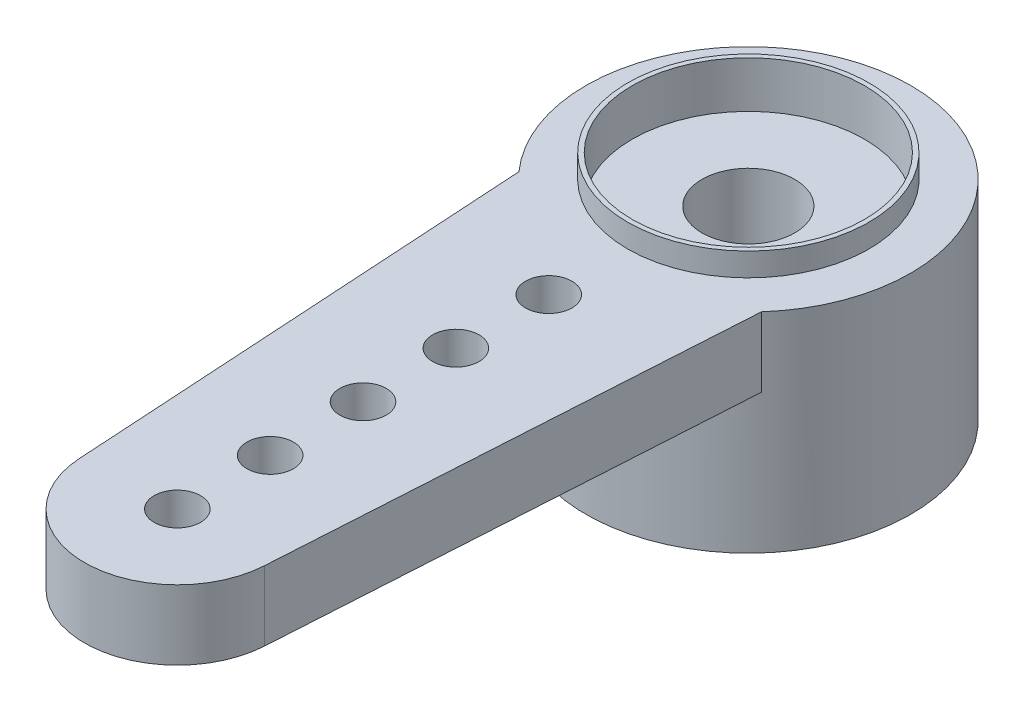
ISO-10303-21;
HEADER;
FILE_DESCRIPTION(('STEP AP214'),'2;1');
FILE_NAME('part.step','',(''),(''),'','','');
FILE_SCHEMA(('AUTOMOTIVE_DESIGN { 1 0 10303 214 1 1 1 1 }'));
ENDSEC;
DATA;
#1=APPLICATION_CONTEXT('core data for automotive mechanical design processes');
#2=APPLICATION_PROTOCOL_DEFINITION('international standard','automotive_design',2000,#1);
#3=PRODUCT_CONTEXT('',#1,'mechanical');
#4=PRODUCT('Part','Part','',(#3));
#5=PRODUCT_RELATED_PRODUCT_CATEGORY('part','',(#4));
#6=PRODUCT_DEFINITION_FORMATION('','',#4);
#7=PRODUCT_DEFINITION_CONTEXT('part definition',#1,'design');
#8=PRODUCT_DEFINITION('design','',#6,#7);
#9=PRODUCT_DEFINITION_SHAPE('','',#8);
#10=(LENGTH_UNIT() NAMED_UNIT(*) SI_UNIT(.MILLI.,.METRE.));
#11=(NAMED_UNIT(*) PLANE_ANGLE_UNIT() SI_UNIT($,.RADIAN.));
#12=(NAMED_UNIT(*) SI_UNIT($,.STERADIAN.) SOLID_ANGLE_UNIT());
#13=UNCERTAINTY_MEASURE_WITH_UNIT(LENGTH_MEASURE(1.E-05),#10,'distance_accuracy_value','');
#14=(GEOMETRIC_REPRESENTATION_CONTEXT(3) GLOBAL_UNCERTAINTY_ASSIGNED_CONTEXT((#13)) GLOBAL_UNIT_ASSIGNED_CONTEXT((#10,
#11,#12)) REPRESENTATION_CONTEXT('',''));
#15=CARTESIAN_POINT('',(0.,0.,0.));
#16=DIRECTION('',(0.,0.,1.));
#17=DIRECTION('',(1.,0.,0.));
#18=AXIS2_PLACEMENT_3D('',#15,#16,#17);
#19=CARTESIAN_POINT('',(0.,0.75,0.));
#20=DIRECTION('',(0.,-1.,0.));
#21=DIRECTION('',(0.,0.,-1.));
#22=AXIS2_PLACEMENT_3D('',#19,#20,#21);
#23=CYLINDRICAL_SURFACE('',#22,1.);
#24=CARTESIAN_POINT('',(0.,-1.25,0.));
#25=DIRECTION('',(0.,1.,0.));
#26=DIRECTION('',(0.,0.,1.));
#27=AXIS2_PLACEMENT_3D('',#24,#25,#26);
#28=CIRCLE('',#27,1.);
#29=CARTESIAN_POINT('',(0.,-1.25,1.));
#30=VERTEX_POINT('',#29);
#31=EDGE_CURVE('E44',#30,#30,#28,.T.);
#32=ORIENTED_EDGE('',*,*,#31,.F.);
#33=EDGE_LOOP('',(#32));
#34=FACE_BOUND('',#33,.T.);
#35=CARTESIAN_POINT('',(0.,0.25,0.));
#36=DIRECTION('',(0.,1.,0.));
#37=DIRECTION('',(0.,0.,1.));
#38=AXIS2_PLACEMENT_3D('',#35,#36,#37);
#39=CIRCLE('',#38,1.);
#40=CARTESIAN_POINT('',(0.,0.25,1.));
#41=VERTEX_POINT('',#40);
#42=EDGE_CURVE('E118',#41,#41,#39,.T.);
#43=ORIENTED_EDGE('',*,*,#42,.T.);
#44=EDGE_LOOP('',(#43));
#45=FACE_BOUND('',#44,.T.);
#46=ADVANCED_FACE('F40',(#34,#45),#23,.F.);
#47=CARTESIAN_POINT('',(0.,0.75,0.));
#48=DIRECTION('',(0.,1.,0.));
#49=DIRECTION('',(0.,0.,1.));
#50=AXIS2_PLACEMENT_3D('',#47,#48,#49);
#51=PLANE('',#50);
#52=CARTESIAN_POINT('',(0.,0.75,4.3));
#53=DIRECTION('',(0.,1.,0.));
#54=DIRECTION('',(0.,0.,1.));
#55=AXIS2_PLACEMENT_3D('',#52,#53,#54);
#56=CIRCLE('',#55,0.5);
#57=CARTESIAN_POINT('',(0.,0.75,4.8));
#58=VERTEX_POINT('',#57);
#59=EDGE_CURVE('E142',#58,#58,#56,.T.);
#60=ORIENTED_EDGE('',*,*,#59,.F.);
#61=EDGE_LOOP('',(#60));
#62=FACE_BOUND('',#61,.T.);
#63=CARTESIAN_POINT('',(0.,0.75,8.3));
#64=DIRECTION('',(0.,1.,0.));
#65=DIRECTION('',(0.,0.,1.));
#66=AXIS2_PLACEMENT_3D('',#63,#64,#65);
#67=CIRCLE('',#66,0.5);
#68=CARTESIAN_POINT('',(0.,0.75,8.8));
#69=VERTEX_POINT('',#68);
#70=EDGE_CURVE('E241',#69,#69,#67,.T.);
#71=ORIENTED_EDGE('',*,*,#70,.F.);
#72=EDGE_LOOP('',(#71));
#73=FACE_BOUND('',#72,.T.);
#74=CARTESIAN_POINT('',(0.,0.75,12.3));
#75=DIRECTION('',(0.,1.,0.));
#76=DIRECTION('',(0.,0.,1.));
#77=AXIS2_PLACEMENT_3D('',#74,#75,#76);
#78=CIRCLE('',#77,0.5);
#79=CARTESIAN_POINT('',(0.,0.75,12.8));
#80=VERTEX_POINT('',#79);
#81=EDGE_CURVE('E148',#80,#80,#78,.T.);
#82=ORIENTED_EDGE('',*,*,#81,.F.);
#83=EDGE_LOOP('',(#82));
#84=FACE_BOUND('',#83,.T.);
#85=CARTESIAN_POINT('',(0.,0.75,0.));
#86=DIRECTION('',(0.,1.,0.));
#87=DIRECTION('',(0.,0.,1.));
#88=AXIS2_PLACEMENT_3D('',#85,#86,#87);
#89=CIRCLE('',#88,3.5);
#90=CARTESIAN_POINT('',(2.61286688724072,0.75,2.32871780805683));
#91=VERTEX_POINT('',#90);
#92=CARTESIAN_POINT('',(-2.61286688724072,0.75,2.32871780805683));
#93=VERTEX_POINT('',#92);
#94=EDGE_CURVE('E105',#91,#93,#89,.T.);
#95=ORIENTED_EDGE('',*,*,#94,.T.);
#96=DIRECTION('',(0.0609756097560975,0.,0.998139256323922));
#97=VECTOR('',#96,1.);
#98=CARTESIAN_POINT('',(-2.61286688724072,0.75,2.32871780805683));
#99=LINE('',#98,#97);
#100=CARTESIAN_POINT('',(-1.99627851264784,0.75,12.4219512195122));
#101=VERTEX_POINT('',#100);
#102=EDGE_CURVE('E85',#93,#101,#99,.T.);
#103=ORIENTED_EDGE('',*,*,#102,.T.);
#104=CARTESIAN_POINT('',(0.,0.75,12.3));
#105=DIRECTION('',(0.,1.,0.));
#106=DIRECTION('',(0.,0.,1.));
#107=AXIS2_PLACEMENT_3D('',#104,#105,#106);
#108=CIRCLE('',#107,2.);
#109=CARTESIAN_POINT('',(1.99627851264784,0.75,12.4219512195122));
#110=VERTEX_POINT('',#109);
#111=EDGE_CURVE('E111',#101,#110,#108,.T.);
#112=ORIENTED_EDGE('',*,*,#111,.T.);
#113=DIRECTION('',(0.0609756097560975,0.,-0.998139256323922));
#114=VECTOR('',#113,1.);
#115=CARTESIAN_POINT('',(1.99627851264784,0.75,12.4219512195122));
#116=LINE('',#115,#114);
#117=EDGE_CURVE('E59',#110,#91,#116,.T.);
#118=ORIENTED_EDGE('',*,*,#117,.T.);
#119=EDGE_LOOP('',(#95,#103,#112,#118));
#120=FACE_BOUND('',#119,.T.);
#121=CARTESIAN_POINT('',(0.,0.75,10.3));
#122=DIRECTION('',(0.,1.,0.));
#123=DIRECTION('',(0.,0.,1.));
#124=AXIS2_PLACEMENT_3D('',#121,#122,#123);
#125=CIRCLE('',#124,0.5);
#126=CARTESIAN_POINT('',(0.,0.75,10.8));
#127=VERTEX_POINT('',#126);
#128=EDGE_CURVE('E159',#127,#127,#125,.T.);
#129=ORIENTED_EDGE('',*,*,#128,.F.);
#130=EDGE_LOOP('',(#129));
#131=FACE_BOUND('',#130,.T.);
#132=CARTESIAN_POINT('',(0.,0.75,6.3));
#133=DIRECTION('',(0.,1.,0.));
#134=DIRECTION('',(0.,0.,1.));
#135=AXIS2_PLACEMENT_3D('',#132,#133,#134);
#136=CIRCLE('',#135,0.5);
#137=CARTESIAN_POINT('',(0.,0.75,6.8));
#138=VERTEX_POINT('',#137);
#139=EDGE_CURVE('E235',#138,#138,#136,.T.);
#140=ORIENTED_EDGE('',*,*,#139,.F.);
#141=EDGE_LOOP('',(#140));
#142=FACE_BOUND('',#141,.T.);
#143=CARTESIAN_POINT('',(0.,0.75,0.));
#144=DIRECTION('',(0.,1.,0.));
#145=DIRECTION('',(0.,0.,1.));
#146=AXIS2_PLACEMENT_3D('',#143,#144,#145);
#147=CIRCLE('',#146,2.6);
#148=CARTESIAN_POINT('',(0.,0.75,2.6));
#149=VERTEX_POINT('',#148);
#150=EDGE_CURVE('E130',#149,#149,#147,.T.);
#151=ORIENTED_EDGE('',*,*,#150,.F.);
#152=EDGE_LOOP('',(#151));
#153=FACE_BOUND('',#152,.T.);
#154=ADVANCED_FACE('F168',(#62,#73,#84,#120,#131,#142,#153),#51,.T.);
#155=CARTESIAN_POINT('',(0.,-0.75,0.));
#156=DIRECTION('',(0.,1.,0.));
#157=DIRECTION('',(0.,0.,1.));
#158=AXIS2_PLACEMENT_3D('',#155,#156,#157);
#159=PLANE('',#158);
#160=CARTESIAN_POINT('',(0.,-0.75,4.3));
#161=DIRECTION('',(0.,1.,0.));
#162=DIRECTION('',(0.,0.,1.));
#163=AXIS2_PLACEMENT_3D('',#160,#161,#162);
#164=CIRCLE('',#163,0.5);
#165=CARTESIAN_POINT('',(0.,-0.75,4.8));
#166=VERTEX_POINT('',#165);
#167=EDGE_CURVE('E221',#166,#166,#164,.T.);
#168=ORIENTED_EDGE('',*,*,#167,.T.);
#169=EDGE_LOOP('',(#168));
#170=FACE_BOUND('',#169,.T.);
#171=CARTESIAN_POINT('',(0.,-0.75,8.3));
#172=DIRECTION('',(0.,1.,0.));
#173=DIRECTION('',(0.,0.,1.));
#174=AXIS2_PLACEMENT_3D('',#171,#172,#173);
#175=CIRCLE('',#174,0.5);
#176=CARTESIAN_POINT('',(0.,-0.75,8.8));
#177=VERTEX_POINT('',#176);
#178=EDGE_CURVE('E225',#177,#177,#175,.T.);
#179=ORIENTED_EDGE('',*,*,#178,.T.);
#180=EDGE_LOOP('',(#179));
#181=FACE_BOUND('',#180,.T.);
#182=CARTESIAN_POINT('',(0.,-0.75,12.3));
#183=DIRECTION('',(0.,1.,0.));
#184=DIRECTION('',(0.,0.,1.));
#185=AXIS2_PLACEMENT_3D('',#182,#183,#184);
#186=CIRCLE('',#185,0.5);
#187=CARTESIAN_POINT('',(0.,-0.75,12.8));
#188=VERTEX_POINT('',#187);
#189=EDGE_CURVE('E154',#188,#188,#186,.T.);
#190=ORIENTED_EDGE('',*,*,#189,.T.);
#191=EDGE_LOOP('',(#190));
#192=FACE_BOUND('',#191,.T.);
#193=CARTESIAN_POINT('',(0.,-0.75,10.3));
#194=DIRECTION('',(0.,1.,0.));
#195=DIRECTION('',(0.,0.,1.));
#196=AXIS2_PLACEMENT_3D('',#193,#194,#195);
#197=CIRCLE('',#196,0.5);
#198=CARTESIAN_POINT('',(0.,-0.75,10.8));
#199=VERTEX_POINT('',#198);
#200=EDGE_CURVE('E162',#199,#199,#197,.T.);
#201=ORIENTED_EDGE('',*,*,#200,.T.);
#202=EDGE_LOOP('',(#201));
#203=FACE_BOUND('',#202,.T.);
#204=CARTESIAN_POINT('',(0.,-0.75,6.3));
#205=DIRECTION('',(0.,1.,0.));
#206=DIRECTION('',(0.,0.,1.));
#207=AXIS2_PLACEMENT_3D('',#204,#205,#206);
#208=CIRCLE('',#207,0.5);
#209=CARTESIAN_POINT('',(0.,-0.75,6.8));
#210=VERTEX_POINT('',#209);
#211=EDGE_CURVE('E233',#210,#210,#208,.T.);
#212=ORIENTED_EDGE('',*,*,#211,.T.);
#213=EDGE_LOOP('',(#212));
#214=FACE_BOUND('',#213,.T.);
#215=CARTESIAN_POINT('',(0.,-0.75,0.));
#216=DIRECTION('',(0.,-1.,0.));
#217=DIRECTION('',(0.,0.,-1.));
#218=AXIS2_PLACEMENT_3D('',#215,#216,#217);
#219=CIRCLE('',#218,3.5);
#220=CARTESIAN_POINT('',(2.61286688724072,-0.75,2.32871780805683));
#221=VERTEX_POINT('',#220);
#222=CARTESIAN_POINT('',(-2.61286688724072,-0.75,2.32871780805683));
#223=VERTEX_POINT('',#222);
#224=EDGE_CURVE('E90',#221,#223,#219,.T.);
#225=ORIENTED_EDGE('',*,*,#224,.F.);
#226=DIRECTION('',(0.0609756097560975,0.,-0.998139256323922));
#227=VECTOR('',#226,1.);
#228=CARTESIAN_POINT('',(1.99627851264784,-0.75,12.4219512195122));
#229=LINE('',#228,#227);
#230=CARTESIAN_POINT('',(1.99627851264784,-0.75,12.4219512195122));
#231=VERTEX_POINT('',#230);
#232=EDGE_CURVE('E93',#231,#221,#229,.T.);
#233=ORIENTED_EDGE('',*,*,#232,.F.);
#234=CARTESIAN_POINT('',(0.,-0.75,12.3));
#235=DIRECTION('',(0.,1.,0.));
#236=DIRECTION('',(0.,0.,1.));
#237=AXIS2_PLACEMENT_3D('',#234,#235,#236);
#238=CIRCLE('',#237,2.);
#239=CARTESIAN_POINT('',(-1.99627851264784,-0.75,12.4219512195122));
#240=VERTEX_POINT('',#239);
#241=EDGE_CURVE('E80',#240,#231,#238,.T.);
#242=ORIENTED_EDGE('',*,*,#241,.F.);
#243=DIRECTION('',(0.0609756097560975,0.,0.998139256323922));
#244=VECTOR('',#243,1.);
#245=CARTESIAN_POINT('',(-2.61286688724072,-0.75,2.32871780805683));
#246=LINE('',#245,#244);
#247=EDGE_CURVE('E73',#223,#240,#246,.T.);
#248=ORIENTED_EDGE('',*,*,#247,.F.);
#249=EDGE_LOOP('',(#225,#233,#242,#248));
#250=FACE_BOUND('',#249,.T.);
#251=ADVANCED_FACE('F92',(#170,#181,#192,#203,#214,#250),#159,.F.);
#252=CARTESIAN_POINT('',(0.,-1.25,0.));
#253=DIRECTION('',(0.,1.,0.));
#254=DIRECTION('',(0.,0.,1.));
#255=AXIS2_PLACEMENT_3D('',#252,#253,#254);
#256=PLANE('',#255);
#257=CARTESIAN_POINT('',(0.,-1.25,0.));
#258=DIRECTION('',(0.,1.,0.));
#259=DIRECTION('',(0.,0.,1.));
#260=AXIS2_PLACEMENT_3D('',#257,#258,#259);
#261=CIRCLE('',#260,2.375);
#262=CARTESIAN_POINT('',(0.,-1.25,2.375));
#263=VERTEX_POINT('',#262);
#264=EDGE_CURVE('E122',#263,#263,#261,.F.);
#265=ORIENTED_EDGE('',*,*,#264,.T.);
#266=EDGE_LOOP('',(#265));
#267=FACE_BOUND('',#266,.T.);
#268=ORIENTED_EDGE('',*,*,#31,.T.);
#269=EDGE_LOOP('',(#268));
#270=FACE_BOUND('',#269,.T.);
#271=ADVANCED_FACE('F42',(#267,#270),#256,.F.);
#272=CARTESIAN_POINT('',(0.,0.75,0.));
#273=DIRECTION('',(0.,-1.,0.));
#274=DIRECTION('',(0.,0.,-1.));
#275=AXIS2_PLACEMENT_3D('',#272,#273,#274);
#276=CYLINDRICAL_SURFACE('',#275,3.5);
#277=DIRECTION('',(0.,-1.,0.));
#278=VECTOR('',#277,1.);
#279=CARTESIAN_POINT('',(2.61286688724072,0.75,2.32871780805683));
#280=LINE('',#279,#278);
#281=EDGE_CURVE('E102',#91,#221,#280,.T.);
#282=ORIENTED_EDGE('',*,*,#281,.T.);
#283=ORIENTED_EDGE('',*,*,#224,.T.);
#284=DIRECTION('',(0.,-1.,0.));
#285=VECTOR('',#284,1.);
#286=CARTESIAN_POINT('',(-2.61286688724072,0.75,2.32871780805683));
#287=LINE('',#286,#285);
#288=EDGE_CURVE('E13',#93,#223,#287,.T.);
#289=ORIENTED_EDGE('',*,*,#288,.F.);
#290=ORIENTED_EDGE('',*,*,#94,.F.);
#291=EDGE_LOOP('',(#282,#283,#289,#290));
#292=FACE_BOUND('',#291,.T.);
#293=CARTESIAN_POINT('',(0.,-3.75,0.));
#294=DIRECTION('',(0.,-1.,0.));
#295=DIRECTION('',(0.,0.,-1.));
#296=AXIS2_PLACEMENT_3D('',#293,#294,#295);
#297=CIRCLE('',#296,3.5);
#298=CARTESIAN_POINT('',(0.,-3.75,-3.5));
#299=VERTEX_POINT('',#298);
#300=EDGE_CURVE('E97',#299,#299,#297,.T.);
#301=ORIENTED_EDGE('',*,*,#300,.F.);
#302=EDGE_LOOP('',(#301));
#303=FACE_BOUND('',#302,.T.);
#304=ADVANCED_FACE('F107',(#292,#303),#276,.T.);
#305=CARTESIAN_POINT('',(-2.61286688724072,0.75,2.32871780805683));
#306=DIRECTION('',(0.998139256323922,0.,-0.0609756097560975));
#307=DIRECTION('',(-0.0609756097560975,0.,-0.998139256323922));
#308=AXIS2_PLACEMENT_3D('',#305,#306,#307);
#309=PLANE('',#308);
#310=ORIENTED_EDGE('',*,*,#247,.T.);
#311=DIRECTION('',(0.,-1.,0.));
#312=VECTOR('',#311,1.);
#313=CARTESIAN_POINT('',(-1.99627851264784,0.75,12.4219512195122));
#314=LINE('',#313,#312);
#315=EDGE_CURVE('E50',#101,#240,#314,.T.);
#316=ORIENTED_EDGE('',*,*,#315,.F.);
#317=ORIENTED_EDGE('',*,*,#102,.F.);
#318=ORIENTED_EDGE('',*,*,#288,.T.);
#319=EDGE_LOOP('',(#310,#316,#317,#318));
#320=FACE_BOUND('',#319,.T.);
#321=ADVANCED_FACE('F172',(#320),#309,.F.);
#322=CARTESIAN_POINT('',(0.,0.75,12.3));
#323=DIRECTION('',(0.,-1.,0.));
#324=DIRECTION('',(0.,0.,-1.));
#325=AXIS2_PLACEMENT_3D('',#322,#323,#324);
#326=CYLINDRICAL_SURFACE('',#325,2.);
#327=ORIENTED_EDGE('',*,*,#241,.T.);
#328=DIRECTION('',(0.,-1.,0.));
#329=VECTOR('',#328,1.);
#330=CARTESIAN_POINT('',(1.99627851264784,0.75,12.4219512195122));
#331=LINE('',#330,#329);
#332=EDGE_CURVE('E104',#110,#231,#331,.T.);
#333=ORIENTED_EDGE('',*,*,#332,.F.);
#334=ORIENTED_EDGE('',*,*,#111,.F.);
#335=ORIENTED_EDGE('',*,*,#315,.T.);
#336=EDGE_LOOP('',(#327,#333,#334,#335));
#337=FACE_BOUND('',#336,.T.);
#338=ADVANCED_FACE('F170',(#337),#326,.T.);
#339=CARTESIAN_POINT('',(1.99627851264784,0.75,12.4219512195122));
#340=DIRECTION('',(-0.998139256323922,0.,-0.0609756097560975));
#341=DIRECTION('',(-0.0609756097560975,0.,0.998139256323922));
#342=AXIS2_PLACEMENT_3D('',#339,#340,#341);
#343=PLANE('',#342);
#344=ORIENTED_EDGE('',*,*,#232,.T.);
#345=ORIENTED_EDGE('',*,*,#281,.F.);
#346=ORIENTED_EDGE('',*,*,#117,.F.);
#347=ORIENTED_EDGE('',*,*,#332,.T.);
#348=EDGE_LOOP('',(#344,#345,#346,#347));
#349=FACE_BOUND('',#348,.T.);
#350=ADVANCED_FACE('F101',(#349),#343,.F.);
#351=CARTESIAN_POINT('',(0.,0.75,12.3));
#352=DIRECTION('',(0.,-1.,0.));
#353=DIRECTION('',(0.,0.,-1.));
#354=AXIS2_PLACEMENT_3D('',#351,#352,#353);
#355=CYLINDRICAL_SURFACE('',#354,0.5);
#356=ORIENTED_EDGE('',*,*,#81,.T.);
#357=EDGE_LOOP('',(#356));
#358=FACE_BOUND('',#357,.T.);
#359=ORIENTED_EDGE('',*,*,#189,.F.);
#360=EDGE_LOOP('',(#359));
#361=FACE_BOUND('',#360,.T.);
#362=ADVANCED_FACE('F178',(#358,#361),#355,.F.);
#363=CARTESIAN_POINT('',(0.,0.75,10.3));
#364=DIRECTION('',(0.,-1.,0.));
#365=DIRECTION('',(0.,0.,-1.));
#366=AXIS2_PLACEMENT_3D('',#363,#364,#365);
#367=CYLINDRICAL_SURFACE('',#366,0.5);
#368=ORIENTED_EDGE('',*,*,#128,.T.);
#369=EDGE_LOOP('',(#368));
#370=FACE_BOUND('',#369,.T.);
#371=ORIENTED_EDGE('',*,*,#200,.F.);
#372=EDGE_LOOP('',(#371));
#373=FACE_BOUND('',#372,.T.);
#374=ADVANCED_FACE('F206',(#370,#373),#367,.F.);
#375=CARTESIAN_POINT('',(0.,0.75,8.3));
#376=DIRECTION('',(0.,-1.,0.));
#377=DIRECTION('',(0.,0.,-1.));
#378=AXIS2_PLACEMENT_3D('',#375,#376,#377);
#379=CYLINDRICAL_SURFACE('',#378,0.5);
#380=ORIENTED_EDGE('',*,*,#70,.T.);
#381=EDGE_LOOP('',(#380));
#382=FACE_BOUND('',#381,.T.);
#383=ORIENTED_EDGE('',*,*,#178,.F.);
#384=EDGE_LOOP('',(#383));
#385=FACE_BOUND('',#384,.T.);
#386=ADVANCED_FACE('F202',(#382,#385),#379,.F.);
#387=CARTESIAN_POINT('',(0.,0.75,6.3));
#388=DIRECTION('',(0.,-1.,0.));
#389=DIRECTION('',(0.,0.,-1.));
#390=AXIS2_PLACEMENT_3D('',#387,#388,#389);
#391=CYLINDRICAL_SURFACE('',#390,0.5);
#392=ORIENTED_EDGE('',*,*,#139,.T.);
#393=EDGE_LOOP('',(#392));
#394=FACE_BOUND('',#393,.T.);
#395=ORIENTED_EDGE('',*,*,#211,.F.);
#396=EDGE_LOOP('',(#395));
#397=FACE_BOUND('',#396,.T.);
#398=ADVANCED_FACE('F198',(#394,#397),#391,.F.);
#399=CARTESIAN_POINT('',(0.,0.75,4.3));
#400=DIRECTION('',(0.,-1.,0.));
#401=DIRECTION('',(0.,0.,-1.));
#402=AXIS2_PLACEMENT_3D('',#399,#400,#401);
#403=CYLINDRICAL_SURFACE('',#402,0.5);
#404=ORIENTED_EDGE('',*,*,#59,.T.);
#405=EDGE_LOOP('',(#404));
#406=FACE_BOUND('',#405,.T.);
#407=ORIENTED_EDGE('',*,*,#167,.F.);
#408=EDGE_LOOP('',(#407));
#409=FACE_BOUND('',#408,.T.);
#410=ADVANCED_FACE('F195',(#406,#409),#403,.F.);
#411=CARTESIAN_POINT('',(0.,-3.75,0.));
#412=DIRECTION('',(0.,-1.,0.));
#413=DIRECTION('',(0.,0.,-1.));
#414=AXIS2_PLACEMENT_3D('',#411,#412,#413);
#415=PLANE('',#414);
#416=ORIENTED_EDGE('',*,*,#300,.T.);
#417=EDGE_LOOP('',(#416));
#418=FACE_BOUND('',#417,.T.);
#419=CARTESIAN_POINT('',(0.,-3.75,0.));
#420=DIRECTION('',(0.,-1.,0.));
#421=DIRECTION('',(0.,0.,-1.));
#422=AXIS2_PLACEMENT_3D('',#419,#420,#421);
#423=CIRCLE('',#422,2.375);
#424=CARTESIAN_POINT('',(0.,-3.75,-2.375));
#425=VERTEX_POINT('',#424);
#426=EDGE_CURVE('E98',#425,#425,#423,.T.);
#427=ORIENTED_EDGE('',*,*,#426,.F.);
#428=EDGE_LOOP('',(#427));
#429=FACE_BOUND('',#428,.T.);
#430=ADVANCED_FACE('F193',(#418,#429),#415,.T.);
#431=CARTESIAN_POINT('',(0.,-3.75,0.));
#432=DIRECTION('',(0.,1.,0.));
#433=DIRECTION('',(0.,0.,1.));
#434=AXIS2_PLACEMENT_3D('',#431,#432,#433);
#435=CYLINDRICAL_SURFACE('',#434,2.375);
#436=ORIENTED_EDGE('',*,*,#426,.T.);
#437=EDGE_LOOP('',(#436));
#438=FACE_BOUND('',#437,.T.);
#439=ORIENTED_EDGE('',*,*,#264,.F.);
#440=EDGE_LOOP('',(#439));
#441=FACE_BOUND('',#440,.T.);
#442=ADVANCED_FACE('F265',(#438,#441),#435,.F.);
#443=CARTESIAN_POINT('',(0.,1.25,0.));
#444=DIRECTION('',(0.,1.,0.));
#445=DIRECTION('',(0.,0.,1.));
#446=AXIS2_PLACEMENT_3D('',#443,#444,#445);
#447=PLANE('',#446);
#448=CARTESIAN_POINT('',(0.,1.25,0.));
#449=DIRECTION('',(0.,1.,0.));
#450=DIRECTION('',(0.,0.,1.));
#451=AXIS2_PLACEMENT_3D('',#448,#449,#450);
#452=CIRCLE('',#451,2.6);
#453=CARTESIAN_POINT('',(0.,1.25,2.6));
#454=VERTEX_POINT('',#453);
#455=EDGE_CURVE('E124',#454,#454,#452,.T.);
#456=ORIENTED_EDGE('',*,*,#455,.T.);
#457=EDGE_LOOP('',(#456));
#458=FACE_BOUND('',#457,.T.);
#459=CARTESIAN_POINT('',(0.,1.25,0.));
#460=DIRECTION('',(0.,1.,0.));
#461=DIRECTION('',(1.,0.,0.));
#462=AXIS2_PLACEMENT_3D('',#459,#460,#461);
#463=CIRCLE('',#462,2.5);
#464=CARTESIAN_POINT('',(2.5,1.25,0.));
#465=VERTEX_POINT('',#464);
#466=EDGE_CURVE('E120',#465,#465,#463,.T.);
#467=ORIENTED_EDGE('',*,*,#466,.F.);
#468=EDGE_LOOP('',(#467));
#469=FACE_BOUND('',#468,.T.);
#470=ADVANCED_FACE('F255',(#458,#469),#447,.T.);
#471=CARTESIAN_POINT('',(0.,1.25,0.));
#472=DIRECTION('',(0.,-1.,0.));
#473=DIRECTION('',(0.,0.,-1.));
#474=AXIS2_PLACEMENT_3D('',#471,#472,#473);
#475=CYLINDRICAL_SURFACE('',#474,2.6);
#476=ORIENTED_EDGE('',*,*,#455,.F.);
#477=EDGE_LOOP('',(#476));
#478=FACE_BOUND('',#477,.T.);
#479=ORIENTED_EDGE('',*,*,#150,.T.);
#480=EDGE_LOOP('',(#479));
#481=FACE_BOUND('',#480,.T.);
#482=ADVANCED_FACE('F252',(#478,#481),#475,.T.);
#483=CARTESIAN_POINT('',(0.,1.25,0.));
#484=DIRECTION('',(0.,-1.,0.));
#485=DIRECTION('',(0.,0.,-1.));
#486=AXIS2_PLACEMENT_3D('',#483,#484,#485);
#487=CYLINDRICAL_SURFACE('',#486,2.5);
#488=ORIENTED_EDGE('',*,*,#466,.T.);
#489=EDGE_LOOP('',(#488));
#490=FACE_BOUND('',#489,.T.);
#491=CARTESIAN_POINT('',(0.,0.25,0.));
#492=DIRECTION('',(0.,1.,0.));
#493=DIRECTION('',(0.,0.,1.));
#494=AXIS2_PLACEMENT_3D('',#491,#492,#493);
#495=CIRCLE('',#494,2.5);
#496=CARTESIAN_POINT('',(0.,0.25,2.5));
#497=VERTEX_POINT('',#496);
#498=EDGE_CURVE('E121',#497,#497,#495,.T.);
#499=ORIENTED_EDGE('',*,*,#498,.F.);
#500=EDGE_LOOP('',(#499));
#501=FACE_BOUND('',#500,.T.);
#502=ADVANCED_FACE('F254',(#490,#501),#487,.F.);
#503=CARTESIAN_POINT('',(0.,0.25,0.));
#504=DIRECTION('',(0.,1.,0.));
#505=DIRECTION('',(0.,0.,1.));
#506=AXIS2_PLACEMENT_3D('',#503,#504,#505);
#507=PLANE('',#506);
#508=ORIENTED_EDGE('',*,*,#42,.F.);
#509=EDGE_LOOP('',(#508));
#510=FACE_BOUND('',#509,.T.);
#511=ORIENTED_EDGE('',*,*,#498,.T.);
#512=EDGE_LOOP('',(#511));
#513=FACE_BOUND('',#512,.T.);
#514=ADVANCED_FACE('F262',(#510,#513),#507,.T.);
#515=CLOSED_SHELL('',(#46,#154,#251,#271,#304,#321,#338,#350,#362,#374,#386,#398,#410,#430,#442,
#470,#482,#502,#514));
#516=MANIFOLD_SOLID_BREP('B2',#515);
#517=ADVANCED_BREP_SHAPE_REPRESENTATION('',(#18,#516),#14);
#518=SHAPE_DEFINITION_REPRESENTATION(#9,#517);
ENDSEC;
END-ISO-10303-21;
